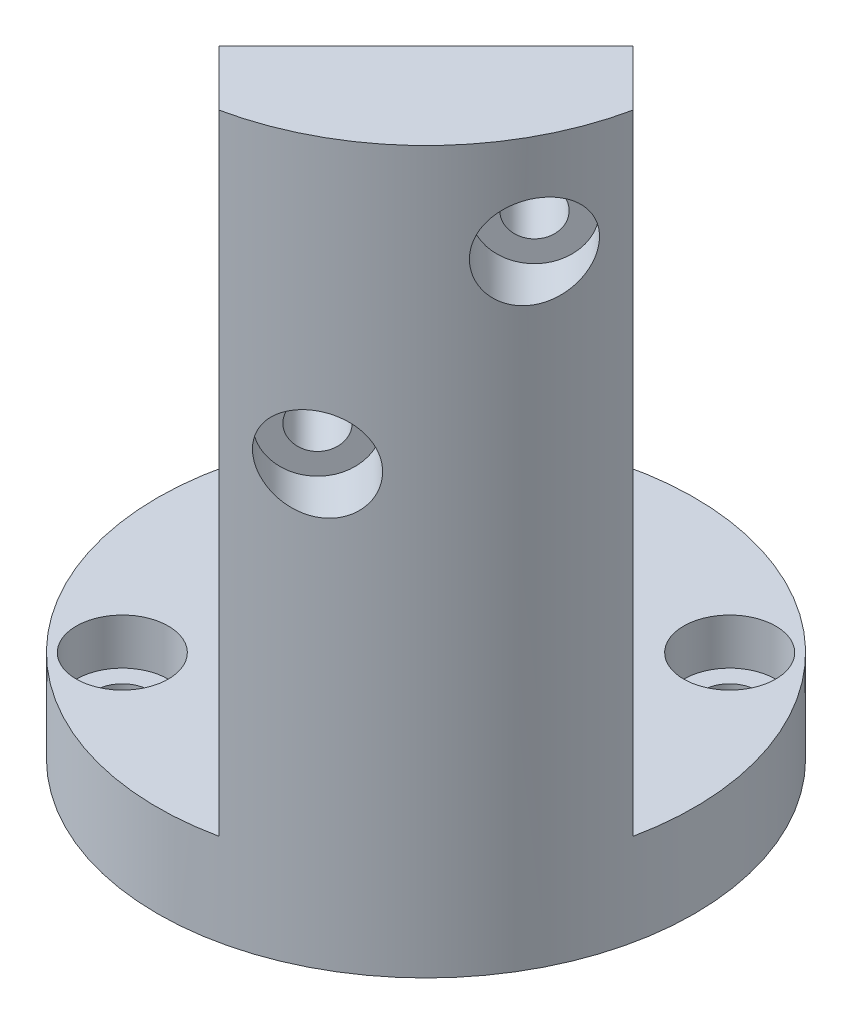
ISO-10303-21;
HEADER;
FILE_DESCRIPTION(('STEP AP214'),'2;1');
FILE_NAME('part.step','',(''),(''),'','','');
FILE_SCHEMA(('AUTOMOTIVE_DESIGN { 1 0 10303 214 1 1 1 1 }'));
ENDSEC;
DATA;
#1=APPLICATION_CONTEXT('core data for automotive mechanical design processes');
#2=APPLICATION_PROTOCOL_DEFINITION('international standard','automotive_design',2000,#1);
#3=PRODUCT_CONTEXT('',#1,'mechanical');
#4=PRODUCT('Part','Part','',(#3));
#5=PRODUCT_RELATED_PRODUCT_CATEGORY('part','',(#4));
#6=PRODUCT_DEFINITION_FORMATION('','',#4);
#7=PRODUCT_DEFINITION_CONTEXT('part definition',#1,'design');
#8=PRODUCT_DEFINITION('design','',#6,#7);
#9=PRODUCT_DEFINITION_SHAPE('','',#8);
#10=(LENGTH_UNIT() NAMED_UNIT(*) SI_UNIT(.MILLI.,.METRE.));
#11=(NAMED_UNIT(*) PLANE_ANGLE_UNIT() SI_UNIT($,.RADIAN.));
#12=(NAMED_UNIT(*) SI_UNIT($,.STERADIAN.) SOLID_ANGLE_UNIT());
#13=UNCERTAINTY_MEASURE_WITH_UNIT(LENGTH_MEASURE(1.E-05),#10,'distance_accuracy_value','');
#14=(GEOMETRIC_REPRESENTATION_CONTEXT(3) GLOBAL_UNCERTAINTY_ASSIGNED_CONTEXT((#13)) GLOBAL_UNIT_ASSIGNED_CONTEXT((#10,
#11,#12)) REPRESENTATION_CONTEXT('',''));
#15=CARTESIAN_POINT('',(0.,0.,0.));
#16=DIRECTION('',(0.,0.,1.));
#17=DIRECTION('',(1.,0.,0.));
#18=AXIS2_PLACEMENT_3D('',#15,#16,#17);
#19=CARTESIAN_POINT('',(-4.75,4.,0.));
#20=DIRECTION('',(0.,-1.,0.));
#21=DIRECTION('',(0.,0.,-1.));
#22=AXIS2_PLACEMENT_3D('',#19,#20,#21);
#23=PLANE('',#22);
#24=CARTESIAN_POINT('',(0.,4.,0.));
#25=DIRECTION('',(0.,1.,0.));
#26=DIRECTION('',(-1.,0.,0.));
#27=AXIS2_PLACEMENT_3D('',#24,#25,#26);
#28=CIRCLE('',#27,3.);
#29=CARTESIAN_POINT('',(-3.,4.,0.));
#30=VERTEX_POINT('',#29);
#31=EDGE_CURVE('E21',#30,#30,#28,.T.);
#32=ORIENTED_EDGE('',*,*,#31,.T.);
#33=EDGE_LOOP('',(#32));
#34=FACE_BOUND('',#33,.T.);
#35=CARTESIAN_POINT('',(0.,4.,0.));
#36=DIRECTION('',(0.,1.,0.));
#37=DIRECTION('',(-1.,0.,0.));
#38=AXIS2_PLACEMENT_3D('',#35,#36,#37);
#39=CIRCLE('',#38,8.5);
#40=CARTESIAN_POINT('',(-8.5,4.,0.));
#41=VERTEX_POINT('',#40);
#42=EDGE_CURVE('E254',#41,#41,#39,.F.);
#43=ORIENTED_EDGE('',*,*,#42,.T.);
#44=EDGE_LOOP('',(#43));
#45=FACE_BOUND('',#44,.T.);
#46=ADVANCED_FACE('F17',(#34,#45),#23,.T.);
#47=CARTESIAN_POINT('',(6.01040764008564,28.5,13.0814754519511));
#48=DIRECTION('',(-0.707106781186548,0.,-0.707106781186548));
#49=DIRECTION('',(-0.707106781186548,0.,0.707106781186548));
#50=AXIS2_PLACEMENT_3D('',#47,#48,#49);
#51=CYLINDRICAL_SURFACE('',#50,1.6);
#52=CARTESIAN_POINT('',(6.01040764008564,28.5,13.0814754519511));
#53=DIRECTION('',(-0.707106781186548,0.,-0.707106781186548));
#54=DIRECTION('',(-0.707106781186548,0.,0.707106781186548));
#55=AXIS2_PLACEMENT_3D('',#52,#53,#54);
#56=CIRCLE('',#55,1.6);
#57=CARTESIAN_POINT('',(4.87903679018717,28.5,14.2128463018496));
#58=VERTEX_POINT('',#57);
#59=EDGE_CURVE('E113',#58,#58,#56,.F.);
#60=ORIENTED_EDGE('',*,*,#59,.T.);
#61=EDGE_LOOP('',(#60));
#62=FACE_BOUND('',#61,.T.);
#63=CARTESIAN_POINT('',(3.21733585439878,28.5,10.2884036662643));
#64=DIRECTION('',(-0.707106781186548,0.,-0.707106781186548));
#65=DIRECTION('',(-0.707106781186548,0.,0.707106781186548));
#66=AXIS2_PLACEMENT_3D('',#63,#64,#65);
#67=CIRCLE('',#66,1.6);
#68=CARTESIAN_POINT('',(2.0859650045003,28.5,11.4197745161627));
#69=VERTEX_POINT('',#68);
#70=EDGE_CURVE('E241',#69,#69,#67,.F.);
#71=ORIENTED_EDGE('',*,*,#70,.F.);
#72=EDGE_LOOP('',(#71));
#73=FACE_BOUND('',#72,.T.);
#74=ADVANCED_FACE('F260',(#62,#73),#51,.F.);
#75=CARTESIAN_POINT('',(13.0814754519511,40.5,6.01040764008565));
#76=DIRECTION('',(-0.707106781186548,0.,-0.707106781186548));
#77=DIRECTION('',(-0.707106781186548,0.,0.707106781186548));
#78=AXIS2_PLACEMENT_3D('',#75,#76,#77);
#79=CYLINDRICAL_SURFACE('',#78,1.6);
#80=CARTESIAN_POINT('',(13.0814754519511,40.5,6.01040764008565));
#81=DIRECTION('',(-0.707106781186548,0.,-0.707106781186548));
#82=DIRECTION('',(-0.707106781186548,0.,0.707106781186548));
#83=AXIS2_PLACEMENT_3D('',#80,#81,#82);
#84=CIRCLE('',#83,1.6);
#85=CARTESIAN_POINT('',(11.9501046020526,40.5,7.14177848998413));
#86=VERTEX_POINT('',#85);
#87=EDGE_CURVE('E234',#86,#86,#84,.F.);
#88=ORIENTED_EDGE('',*,*,#87,.T.);
#89=EDGE_LOOP('',(#88));
#90=FACE_BOUND('',#89,.T.);
#91=CARTESIAN_POINT('',(10.2884036662643,40.5,3.21733585439879));
#92=DIRECTION('',(-0.707106781186548,0.,-0.707106781186548));
#93=DIRECTION('',(-0.707106781186548,0.,0.707106781186548));
#94=AXIS2_PLACEMENT_3D('',#91,#92,#93);
#95=CIRCLE('',#94,1.6);
#96=CARTESIAN_POINT('',(9.15703281636578,40.5,4.34870670429727));
#97=VERTEX_POINT('',#96);
#98=EDGE_CURVE('E114',#97,#97,#95,.F.);
#99=ORIENTED_EDGE('',*,*,#98,.F.);
#100=EDGE_LOOP('',(#99));
#101=FACE_BOUND('',#100,.T.);
#102=ADVANCED_FACE('F264',(#90,#101),#79,.F.);
#103=CARTESIAN_POINT('',(9.89949493661166,3.,-9.89949493661167));
#104=DIRECTION('',(0.,1.,0.));
#105=DIRECTION('',(0.,0.,1.));
#106=AXIS2_PLACEMENT_3D('',#103,#104,#105);
#107=PLANE('',#106);
#108=CARTESIAN_POINT('',(9.89949493661167,3.,-9.89949493661167));
#109=DIRECTION('',(0.,1.,0.));
#110=DIRECTION('',(-1.,0.,0.));
#111=AXIS2_PLACEMENT_3D('',#108,#109,#110);
#112=CIRCLE('',#111,1.75);
#113=CARTESIAN_POINT('',(8.14949493661167,3.,-9.89949493661167));
#114=VERTEX_POINT('',#113);
#115=EDGE_CURVE('E231',#114,#114,#112,.F.);
#116=ORIENTED_EDGE('',*,*,#115,.T.);
#117=EDGE_LOOP('',(#116));
#118=FACE_BOUND('',#117,.T.);
#119=CARTESIAN_POINT('',(9.89949493661166,3.,-9.89949493661167));
#120=DIRECTION('',(0.,1.,0.));
#121=DIRECTION('',(-1.,0.,0.));
#122=AXIS2_PLACEMENT_3D('',#119,#120,#121);
#123=CIRCLE('',#122,3.);
#124=CARTESIAN_POINT('',(6.89949493661166,3.,-9.89949493661167));
#125=VERTEX_POINT('',#124);
#126=EDGE_CURVE('E249',#125,#125,#123,.T.);
#127=ORIENTED_EDGE('',*,*,#126,.T.);
#128=EDGE_LOOP('',(#127));
#129=FACE_BOUND('',#128,.T.);
#130=ADVANCED_FACE('F269',(#118,#129),#107,.T.);
#131=CARTESIAN_POINT('',(-9.89949493661167,3.,9.89949493661167));
#132=DIRECTION('',(0.,1.,0.));
#133=DIRECTION('',(0.,0.,1.));
#134=AXIS2_PLACEMENT_3D('',#131,#132,#133);
#135=PLANE('',#134);
#136=CARTESIAN_POINT('',(-9.89949493661166,3.,9.89949493661167));
#137=DIRECTION('',(0.,1.,0.));
#138=DIRECTION('',(-1.,0.,0.));
#139=AXIS2_PLACEMENT_3D('',#136,#137,#138);
#140=CIRCLE('',#139,1.75);
#141=CARTESIAN_POINT('',(-11.6494949366117,3.,9.89949493661167));
#142=VERTEX_POINT('',#141);
#143=EDGE_CURVE('E228',#142,#142,#140,.F.);
#144=ORIENTED_EDGE('',*,*,#143,.T.);
#145=EDGE_LOOP('',(#144));
#146=FACE_BOUND('',#145,.T.);
#147=CARTESIAN_POINT('',(-9.89949493661167,3.,9.89949493661167));
#148=DIRECTION('',(0.,1.,0.));
#149=DIRECTION('',(-1.,0.,0.));
#150=AXIS2_PLACEMENT_3D('',#147,#148,#149);
#151=CIRCLE('',#150,3.);
#152=CARTESIAN_POINT('',(-12.8994949366117,3.,9.89949493661167));
#153=VERTEX_POINT('',#152);
#154=EDGE_CURVE('E247',#153,#153,#151,.T.);
#155=ORIENTED_EDGE('',*,*,#154,.T.);
#156=EDGE_LOOP('',(#155));
#157=FACE_BOUND('',#156,.T.);
#158=ADVANCED_FACE('F275',(#146,#157),#135,.T.);
#159=CARTESIAN_POINT('',(-9.89949493661167,3.,-9.89949493661166));
#160=DIRECTION('',(0.,1.,0.));
#161=DIRECTION('',(0.,0.,1.));
#162=AXIS2_PLACEMENT_3D('',#159,#160,#161);
#163=PLANE('',#162);
#164=CARTESIAN_POINT('',(-9.89949493661167,3.,-9.89949493661166));
#165=DIRECTION('',(0.,1.,0.));
#166=DIRECTION('',(-1.,0.,0.));
#167=AXIS2_PLACEMENT_3D('',#164,#165,#166);
#168=CIRCLE('',#167,1.75);
#169=CARTESIAN_POINT('',(-11.6494949366117,3.,-9.89949493661166));
#170=VERTEX_POINT('',#169);
#171=EDGE_CURVE('E108',#170,#170,#168,.F.);
#172=ORIENTED_EDGE('',*,*,#171,.T.);
#173=EDGE_LOOP('',(#172));
#174=FACE_BOUND('',#173,.T.);
#175=CARTESIAN_POINT('',(-9.89949493661167,3.,-9.89949493661166));
#176=DIRECTION('',(0.,1.,0.));
#177=DIRECTION('',(-1.,0.,0.));
#178=AXIS2_PLACEMENT_3D('',#175,#176,#177);
#179=CIRCLE('',#178,3.);
#180=CARTESIAN_POINT('',(-12.8994949366117,3.,-9.89949493661166));
#181=VERTEX_POINT('',#180);
#182=EDGE_CURVE('E244',#181,#181,#179,.T.);
#183=ORIENTED_EDGE('',*,*,#182,.T.);
#184=EDGE_LOOP('',(#183));
#185=FACE_BOUND('',#184,.T.);
#186=ADVANCED_FACE('F129',(#174,#185),#163,.T.);
#187=CARTESIAN_POINT('',(0.,3.,0.));
#188=DIRECTION('',(0.,1.,0.));
#189=DIRECTION('',(0.,0.,1.));
#190=AXIS2_PLACEMENT_3D('',#187,#188,#189);
#191=TOROIDAL_SURFACE('',#190,8.5,1.);
#192=CARTESIAN_POINT('',(0.,3.,0.));
#193=DIRECTION('',(0.,1.,0.));
#194=DIRECTION('',(-1.,0.,0.));
#195=AXIS2_PLACEMENT_3D('',#192,#193,#194);
#196=CIRCLE('',#195,9.5);
#197=CARTESIAN_POINT('',(-9.5,3.,0.));
#198=VERTEX_POINT('',#197);
#199=EDGE_CURVE('E105',#198,#198,#196,.F.);
#200=ORIENTED_EDGE('',*,*,#199,.T.);
#201=EDGE_LOOP('',(#200));
#202=FACE_BOUND('',#201,.T.);
#203=ORIENTED_EDGE('',*,*,#42,.F.);
#204=EDGE_LOOP('',(#203));
#205=FACE_BOUND('',#204,.T.);
#206=ADVANCED_FACE('F123',(#202,#205),#191,.F.);
#207=CARTESIAN_POINT('',(0.,-62.2568677863261,0.));
#208=DIRECTION('',(0.,1.,0.));
#209=DIRECTION('',(-1.,0.,0.));
#210=AXIS2_PLACEMENT_3D('',#207,#208,#209);
#211=CYLINDRICAL_SURFACE('',#210,3.);
#212=CARTESIAN_POINT('',(0.,6.00000000000001,0.));
#213=DIRECTION('',(0.,1.,0.));
#214=DIRECTION('',(-1.,0.,0.));
#215=AXIS2_PLACEMENT_3D('',#212,#213,#214);
#216=CIRCLE('',#215,3.);
#217=CARTESIAN_POINT('',(-3.,6.,0.));
#218=VERTEX_POINT('',#217);
#219=EDGE_CURVE('E112',#218,#218,#216,.F.);
#220=ORIENTED_EDGE('',*,*,#219,.F.);
#221=EDGE_LOOP('',(#220));
#222=FACE_BOUND('',#221,.T.);
#223=ORIENTED_EDGE('',*,*,#31,.F.);
#224=EDGE_LOOP('',(#223));
#225=FACE_BOUND('',#224,.T.);
#226=ADVANCED_FACE('F128',(#222,#225),#211,.F.);
#227=CARTESIAN_POINT('',(9.89949493661166,4.5,-9.89949493661167));
#228=DIRECTION('',(0.,1.,0.));
#229=DIRECTION('',(-1.,0.,0.));
#230=AXIS2_PLACEMENT_3D('',#227,#228,#229);
#231=CYLINDRICAL_SURFACE('',#230,3.);
#232=ORIENTED_EDGE('',*,*,#126,.F.);
#233=EDGE_LOOP('',(#232));
#234=FACE_BOUND('',#233,.T.);
#235=CARTESIAN_POINT('',(9.89949493661166,6.,-9.89949493661167));
#236=DIRECTION('',(0.,1.,0.));
#237=DIRECTION('',(-1.,0.,0.));
#238=AXIS2_PLACEMENT_3D('',#235,#236,#237);
#239=CIRCLE('',#238,3.);
#240=CARTESIAN_POINT('',(6.89949493661166,6.,-9.89949493661167));
#241=VERTEX_POINT('',#240);
#242=EDGE_CURVE('E221',#241,#241,#239,.F.);
#243=ORIENTED_EDGE('',*,*,#242,.F.);
#244=EDGE_LOOP('',(#243));
#245=FACE_BOUND('',#244,.T.);
#246=ADVANCED_FACE('F291',(#234,#245),#231,.F.);
#247=CARTESIAN_POINT('',(-9.89949493661167,4.5,9.89949493661167));
#248=DIRECTION('',(0.,1.,0.));
#249=DIRECTION('',(-1.,0.,0.));
#250=AXIS2_PLACEMENT_3D('',#247,#248,#249);
#251=CYLINDRICAL_SURFACE('',#250,3.);
#252=ORIENTED_EDGE('',*,*,#154,.F.);
#253=EDGE_LOOP('',(#252));
#254=FACE_BOUND('',#253,.T.);
#255=CARTESIAN_POINT('',(-9.89949493661167,6.,9.89949493661167));
#256=DIRECTION('',(0.,1.,0.));
#257=DIRECTION('',(-1.,0.,0.));
#258=AXIS2_PLACEMENT_3D('',#255,#256,#257);
#259=CIRCLE('',#258,3.);
#260=CARTESIAN_POINT('',(-12.8994949366117,6.,9.89949493661167));
#261=VERTEX_POINT('',#260);
#262=EDGE_CURVE('E218',#261,#261,#259,.F.);
#263=ORIENTED_EDGE('',*,*,#262,.F.);
#264=EDGE_LOOP('',(#263));
#265=FACE_BOUND('',#264,.T.);
#266=ADVANCED_FACE('F287',(#254,#265),#251,.F.);
#267=CARTESIAN_POINT('',(-9.89949493661167,4.5,-9.89949493661166));
#268=DIRECTION('',(0.,1.,0.));
#269=DIRECTION('',(-1.,0.,0.));
#270=AXIS2_PLACEMENT_3D('',#267,#268,#269);
#271=CYLINDRICAL_SURFACE('',#270,3.);
#272=ORIENTED_EDGE('',*,*,#182,.F.);
#273=EDGE_LOOP('',(#272));
#274=FACE_BOUND('',#273,.T.);
#275=CARTESIAN_POINT('',(-9.89949493661167,6.,-9.89949493661166));
#276=DIRECTION('',(0.,1.,0.));
#277=DIRECTION('',(-1.,0.,0.));
#278=AXIS2_PLACEMENT_3D('',#275,#276,#277);
#279=CIRCLE('',#278,3.);
#280=CARTESIAN_POINT('',(-12.8994949366117,6.,-9.89949493661166));
#281=VERTEX_POINT('',#280);
#282=EDGE_CURVE('E104',#281,#281,#279,.F.);
#283=ORIENTED_EDGE('',*,*,#282,.F.);
#284=EDGE_LOOP('',(#283));
#285=FACE_BOUND('',#284,.T.);
#286=ADVANCED_FACE('F290',(#274,#285),#271,.F.);
#287=CARTESIAN_POINT('',(0.,6.,13.5057395206631));
#288=DIRECTION('',(-0.707106781186548,0.,-0.707106781186548));
#289=DIRECTION('',(-0.707106781186548,0.,0.707106781186548));
#290=AXIS2_PLACEMENT_3D('',#287,#288,#289);
#291=PLANE('',#290);
#292=ORIENTED_EDGE('',*,*,#98,.T.);
#293=EDGE_LOOP('',(#292));
#294=FACE_BOUND('',#293,.T.);
#295=ORIENTED_EDGE('',*,*,#70,.T.);
#296=EDGE_LOOP('',(#295));
#297=FACE_BOUND('',#296,.T.);
#298=DIRECTION('',(-0.707106781186547,0.,0.707106781186547));
#299=VECTOR('',#298,1.);
#300=CARTESIAN_POINT('',(13.505739520663,47.,0.));
#301=LINE('',#300,#299);
#302=CARTESIAN_POINT('',(13.505739520663,47.,0.));
#303=VERTEX_POINT('',#302);
#304=CARTESIAN_POINT('',(0.,47.,13.5057395206631));
#305=VERTEX_POINT('',#304);
#306=EDGE_CURVE('E73',#303,#305,#301,.T.);
#307=ORIENTED_EDGE('',*,*,#306,.F.);
#308=DIRECTION('',(0.,1.,0.));
#309=VECTOR('',#308,1.);
#310=CARTESIAN_POINT('',(13.5057395206631,6.00000000000001,0.));
#311=LINE('',#310,#309);
#312=CARTESIAN_POINT('',(13.5057395206631,8.00000000000001,0.));
#313=VERTEX_POINT('',#312);
#314=EDGE_CURVE('E69',#313,#303,#311,.T.);
#315=ORIENTED_EDGE('',*,*,#314,.F.);
#316=DIRECTION('',(0.707106781186548,0.,-0.707106781186548));
#317=VECTOR('',#316,1.);
#318=CARTESIAN_POINT('',(1.18893488016576,8.,12.3168046404973));
#319=LINE('',#318,#317);
#320=CARTESIAN_POINT('',(0.,8.,13.5057395206631));
#321=VERTEX_POINT('',#320);
#322=EDGE_CURVE('E64',#313,#321,#319,.F.);
#323=ORIENTED_EDGE('',*,*,#322,.T.);
#324=DIRECTION('',(0.,1.,0.));
#325=VECTOR('',#324,1.);
#326=CARTESIAN_POINT('',(0.,6.,13.5057395206631));
#327=LINE('',#326,#325);
#328=EDGE_CURVE('E80',#305,#321,#327,.F.);
#329=ORIENTED_EDGE('',*,*,#328,.F.);
#330=EDGE_LOOP('',(#307,#315,#323,#329));
#331=FACE_BOUND('',#330,.T.);
#332=ADVANCED_FACE('F81',(#294,#297,#331),#291,.T.);
#333=CARTESIAN_POINT('',(-0.225278682207334,8.,10.9025910781242));
#334=DIRECTION('',(0.707106781186548,0.,-0.707106781186548));
#335=DIRECTION('',(-0.707106781186548,0.,-0.707106781186548));
#336=AXIS2_PLACEMENT_3D('',#333,#334,#335);
#337=CYLINDRICAL_SURFACE('',#336,2.);
#338=ORIENTED_EDGE('',*,*,#322,.F.);
#339=CARTESIAN_POINT('',(12.09152595829,8.,-1.4142135623731));
#340=DIRECTION('',(0.707106781186548,0.,-0.707106781186548));
#341=DIRECTION('',(-0.707106781186548,0.,-0.707106781186548));
#342=AXIS2_PLACEMENT_3D('',#339,#340,#341);
#343=CIRCLE('',#342,2.);
#344=CARTESIAN_POINT('',(12.09152595829,6.,-1.4142135623731));
#345=VERTEX_POINT('',#344);
#346=EDGE_CURVE('E98',#345,#313,#343,.F.);
#347=ORIENTED_EDGE('',*,*,#346,.F.);
#348=DIRECTION('',(0.707106781186547,0.,-0.707106781186547));
#349=VECTOR('',#348,1.);
#350=CARTESIAN_POINT('',(-1.4142135623731,6.,12.09152595829));
#351=LINE('',#350,#349);
#352=CARTESIAN_POINT('',(-1.4142135623731,6.,12.09152595829));
#353=VERTEX_POINT('',#352);
#354=EDGE_CURVE('E58',#353,#345,#351,.T.);
#355=ORIENTED_EDGE('',*,*,#354,.F.);
#356=CARTESIAN_POINT('',(-1.4142135623731,8.,12.09152595829));
#357=DIRECTION('',(0.707106781186548,0.,-0.707106781186548));
#358=DIRECTION('',(-0.707106781186548,0.,-0.707106781186548));
#359=AXIS2_PLACEMENT_3D('',#356,#357,#358);
#360=CIRCLE('',#359,2.);
#361=EDGE_CURVE('E84',#321,#353,#360,.T.);
#362=ORIENTED_EDGE('',*,*,#361,.F.);
#363=EDGE_LOOP('',(#338,#347,#355,#362));
#364=FACE_BOUND('',#363,.T.);
#365=ADVANCED_FACE('F306',(#364),#337,.F.);
#366=CARTESIAN_POINT('',(6.01040764008564,28.5,13.0814754519511));
#367=DIRECTION('',(-0.707106781186548,0.,-0.707106781186548));
#368=DIRECTION('',(-0.707106781186548,0.,0.707106781186548));
#369=AXIS2_PLACEMENT_3D('',#366,#367,#368);
#370=PLANE('',#369);
#371=ORIENTED_EDGE('',*,*,#59,.F.);
#372=EDGE_LOOP('',(#371));
#373=FACE_BOUND('',#372,.T.);
#374=CARTESIAN_POINT('',(6.01040764008564,28.5,13.0814754519511));
#375=DIRECTION('',(-0.707106781186548,0.,-0.707106781186548));
#376=DIRECTION('',(-0.707106781186548,0.,0.707106781186548));
#377=AXIS2_PLACEMENT_3D('',#374,#375,#376);
#378=CIRCLE('',#377,3.);
#379=CARTESIAN_POINT('',(3.889087296526,28.5,15.2027957955108));
#380=VERTEX_POINT('',#379);
#381=EDGE_CURVE('E210',#380,#380,#378,.F.);
#382=ORIENTED_EDGE('',*,*,#381,.T.);
#383=EDGE_LOOP('',(#382));
#384=FACE_BOUND('',#383,.T.);
#385=ADVANCED_FACE('F338',(#373,#384),#370,.F.);
#386=CARTESIAN_POINT('',(13.0814754519511,40.5,6.01040764008565));
#387=DIRECTION('',(-0.707106781186548,0.,-0.707106781186548));
#388=DIRECTION('',(-0.707106781186548,0.,0.707106781186548));
#389=AXIS2_PLACEMENT_3D('',#386,#387,#388);
#390=PLANE('',#389);
#391=ORIENTED_EDGE('',*,*,#87,.F.);
#392=EDGE_LOOP('',(#391));
#393=FACE_BOUND('',#392,.T.);
#394=CARTESIAN_POINT('',(13.0814754519511,40.5,6.01040764008565));
#395=DIRECTION('',(-0.707106781186548,0.,-0.707106781186548));
#396=DIRECTION('',(-0.707106781186548,0.,0.707106781186548));
#397=AXIS2_PLACEMENT_3D('',#394,#395,#396);
#398=CIRCLE('',#397,3.);
#399=CARTESIAN_POINT('',(10.9601551083915,40.5,8.13172798364529));
#400=VERTEX_POINT('',#399);
#401=EDGE_CURVE('E207',#400,#400,#398,.F.);
#402=ORIENTED_EDGE('',*,*,#401,.T.);
#403=EDGE_LOOP('',(#402));
#404=FACE_BOUND('',#403,.T.);
#405=ADVANCED_FACE('F334',(#393,#404),#390,.F.);
#406=CARTESIAN_POINT('',(9.89949493661168,-43.8598034492716,-9.89949493661167));
#407=DIRECTION('',(0.,1.,0.));
#408=DIRECTION('',(-1.,0.,0.));
#409=AXIS2_PLACEMENT_3D('',#406,#407,#408);
#410=CYLINDRICAL_SURFACE('',#409,1.75);
#411=ORIENTED_EDGE('',*,*,#115,.F.);
#412=EDGE_LOOP('',(#411));
#413=FACE_BOUND('',#412,.T.);
#414=CARTESIAN_POINT('',(9.89949493661167,0.,-9.89949493661167));
#415=DIRECTION('',(0.,1.,0.));
#416=DIRECTION('',(-1.,0.,0.));
#417=AXIS2_PLACEMENT_3D('',#414,#415,#416);
#418=CIRCLE('',#417,1.75);
#419=CARTESIAN_POINT('',(8.14949493661167,0.,-9.89949493661167));
#420=VERTEX_POINT('',#419);
#421=EDGE_CURVE('E187',#420,#420,#418,.T.);
#422=ORIENTED_EDGE('',*,*,#421,.F.);
#423=EDGE_LOOP('',(#422));
#424=FACE_BOUND('',#423,.T.);
#425=ADVANCED_FACE('F330',(#413,#424),#410,.F.);
#426=CARTESIAN_POINT('',(-9.89949493661165,-43.8598034492716,9.89949493661167));
#427=DIRECTION('',(0.,1.,0.));
#428=DIRECTION('',(-1.,0.,0.));
#429=AXIS2_PLACEMENT_3D('',#426,#427,#428);
#430=CYLINDRICAL_SURFACE('',#429,1.75);
#431=ORIENTED_EDGE('',*,*,#143,.F.);
#432=EDGE_LOOP('',(#431));
#433=FACE_BOUND('',#432,.T.);
#434=CARTESIAN_POINT('',(-9.89949493661166,0.,9.89949493661167));
#435=DIRECTION('',(0.,1.,0.));
#436=DIRECTION('',(-1.,0.,0.));
#437=AXIS2_PLACEMENT_3D('',#434,#435,#436);
#438=CIRCLE('',#437,1.75);
#439=CARTESIAN_POINT('',(-11.6494949366117,0.,9.89949493661167));
#440=VERTEX_POINT('',#439);
#441=EDGE_CURVE('E183',#440,#440,#438,.T.);
#442=ORIENTED_EDGE('',*,*,#441,.F.);
#443=EDGE_LOOP('',(#442));
#444=FACE_BOUND('',#443,.T.);
#445=ADVANCED_FACE('F326',(#433,#444),#430,.F.);
#446=CARTESIAN_POINT('',(-9.89949493661166,-43.8598034492716,-9.89949493661166));
#447=DIRECTION('',(0.,1.,0.));
#448=DIRECTION('',(-1.,0.,0.));
#449=AXIS2_PLACEMENT_3D('',#446,#447,#448);
#450=CYLINDRICAL_SURFACE('',#449,1.75);
#451=ORIENTED_EDGE('',*,*,#171,.F.);
#452=EDGE_LOOP('',(#451));
#453=FACE_BOUND('',#452,.T.);
#454=CARTESIAN_POINT('',(-9.89949493661167,0.,-9.89949493661166));
#455=DIRECTION('',(0.,1.,0.));
#456=DIRECTION('',(-1.,0.,0.));
#457=AXIS2_PLACEMENT_3D('',#454,#455,#456);
#458=CIRCLE('',#457,1.75);
#459=CARTESIAN_POINT('',(-11.6494949366117,0.,-9.89949493661166));
#460=VERTEX_POINT('',#459);
#461=EDGE_CURVE('E179',#460,#460,#458,.T.);
#462=ORIENTED_EDGE('',*,*,#461,.F.);
#463=EDGE_LOOP('',(#462));
#464=FACE_BOUND('',#463,.T.);
#465=ADVANCED_FACE('F322',(#453,#464),#450,.F.);
#466=CARTESIAN_POINT('',(0.,2.,0.));
#467=DIRECTION('',(0.,1.,0.));
#468=DIRECTION('',(-1.,0.,0.));
#469=AXIS2_PLACEMENT_3D('',#466,#467,#468);
#470=CYLINDRICAL_SURFACE('',#469,9.5);
#471=ORIENTED_EDGE('',*,*,#199,.F.);
#472=EDGE_LOOP('',(#471));
#473=FACE_BOUND('',#472,.T.);
#474=CARTESIAN_POINT('',(0.,0.,0.));
#475=DIRECTION('',(0.,1.,0.));
#476=DIRECTION('',(-1.,0.,0.));
#477=AXIS2_PLACEMENT_3D('',#474,#475,#476);
#478=CIRCLE('',#477,9.5);
#479=CARTESIAN_POINT('',(-9.5,0.,0.));
#480=VERTEX_POINT('',#479);
#481=EDGE_CURVE('E175',#480,#480,#478,.T.);
#482=ORIENTED_EDGE('',*,*,#481,.F.);
#483=EDGE_LOOP('',(#482));
#484=FACE_BOUND('',#483,.T.);
#485=ADVANCED_FACE('F299',(#473,#484),#470,.F.);
#486=CARTESIAN_POINT('',(-8.75,6.,0.));
#487=DIRECTION('',(0.,1.,0.));
#488=DIRECTION('',(0.,0.,1.));
#489=AXIS2_PLACEMENT_3D('',#486,#487,#488);
#490=PLANE('',#489);
#491=ORIENTED_EDGE('',*,*,#282,.T.);
#492=EDGE_LOOP('',(#491));
#493=FACE_BOUND('',#492,.T.);
#494=ORIENTED_EDGE('',*,*,#262,.T.);
#495=EDGE_LOOP('',(#494));
#496=FACE_BOUND('',#495,.T.);
#497=ORIENTED_EDGE('',*,*,#242,.T.);
#498=EDGE_LOOP('',(#497));
#499=FACE_BOUND('',#498,.T.);
#500=ORIENTED_EDGE('',*,*,#219,.T.);
#501=EDGE_LOOP('',(#500));
#502=FACE_BOUND('',#501,.T.);
#503=DIRECTION('',(0.707106781186548,0.,0.707106781186547));
#504=VECTOR('',#503,1.);
#505=CARTESIAN_POINT('',(3.61649617978265,6.,17.1222357004457));
#506=LINE('',#505,#504);
#507=CARTESIAN_POINT('',(3.61649617978265,6.,17.1222357004457));
#508=VERTEX_POINT('',#507);
#509=EDGE_CURVE('E213',#353,#508,#506,.T.);
#510=ORIENTED_EDGE('',*,*,#509,.F.);
#511=ORIENTED_EDGE('',*,*,#354,.T.);
#512=DIRECTION('',(-0.707106781186548,0.,-0.707106781186548));
#513=VECTOR('',#512,1.);
#514=CARTESIAN_POINT('',(13.5057395206631,6.00000000000001,0.));
#515=LINE('',#514,#513);
#516=CARTESIAN_POINT('',(17.1222357004457,6.,3.61649617978265));
#517=VERTEX_POINT('',#516);
#518=EDGE_CURVE('E101',#517,#345,#515,.T.);
#519=ORIENTED_EDGE('',*,*,#518,.F.);
#520=CARTESIAN_POINT('',(0.,6.,0.));
#521=DIRECTION('',(0.,1.,0.));
#522=DIRECTION('',(-1.,0.,0.));
#523=AXIS2_PLACEMENT_3D('',#520,#521,#522);
#524=CIRCLE('',#523,17.5);
#525=EDGE_CURVE('E200',#508,#517,#524,.F.);
#526=ORIENTED_EDGE('',*,*,#525,.F.);
#527=EDGE_LOOP('',(#510,#511,#519,#526));
#528=FACE_BOUND('',#527,.T.);
#529=ADVANCED_FACE('F295',(#493,#496,#499,#502,#528),#490,.T.);
#530=CARTESIAN_POINT('',(13.5057395206631,6.00000000000001,0.));
#531=DIRECTION('',(0.707106781186548,0.,-0.707106781186548));
#532=DIRECTION('',(-0.707106781186548,0.,-0.707106781186548));
#533=AXIS2_PLACEMENT_3D('',#530,#531,#532);
#534=PLANE('',#533);
#535=ORIENTED_EDGE('',*,*,#346,.T.);
#536=ORIENTED_EDGE('',*,*,#314,.T.);
#537=DIRECTION('',(-0.707106781186548,0.,-0.707106781186547));
#538=VECTOR('',#537,1.);
#539=CARTESIAN_POINT('',(17.1222357004457,47.,3.61649617978265));
#540=LINE('',#539,#538);
#541=CARTESIAN_POINT('',(17.1222357004457,47.,3.61649617978265));
#542=VERTEX_POINT('',#541);
#543=EDGE_CURVE('E76',#542,#303,#540,.T.);
#544=ORIENTED_EDGE('',*,*,#543,.F.);
#545=DIRECTION('',(0.,1.,0.));
#546=VECTOR('',#545,1.);
#547=CARTESIAN_POINT('',(17.1222357004457,3.00000000000001,3.61649617978265));
#548=LINE('',#547,#546);
#549=EDGE_CURVE('E199',#517,#542,#548,.T.);
#550=ORIENTED_EDGE('',*,*,#549,.F.);
#551=ORIENTED_EDGE('',*,*,#518,.T.);
#552=EDGE_LOOP('',(#535,#536,#544,#550,#551));
#553=FACE_BOUND('',#552,.T.);
#554=ADVANCED_FACE('F298',(#553),#534,.T.);
#555=CARTESIAN_POINT('',(9.08943628109238,47.,9.08943628109239));
#556=DIRECTION('',(0.,1.,0.));
#557=DIRECTION('',(0.,0.,1.));
#558=AXIS2_PLACEMENT_3D('',#555,#556,#557);
#559=PLANE('',#558);
#560=ORIENTED_EDGE('',*,*,#543,.T.);
#561=ORIENTED_EDGE('',*,*,#306,.T.);
#562=DIRECTION('',(0.707106781186548,0.,0.707106781186547));
#563=VECTOR('',#562,1.);
#564=CARTESIAN_POINT('',(3.61649617978264,47.,17.1222357004457));
#565=LINE('',#564,#563);
#566=CARTESIAN_POINT('',(3.61649617978263,47.,17.1222357004457));
#567=VERTEX_POINT('',#566);
#568=EDGE_CURVE('E36',#567,#305,#565,.F.);
#569=ORIENTED_EDGE('',*,*,#568,.F.);
#570=CARTESIAN_POINT('',(0.,47.,0.));
#571=DIRECTION('',(0.,1.,0.));
#572=DIRECTION('',(-1.,0.,0.));
#573=AXIS2_PLACEMENT_3D('',#570,#571,#572);
#574=CIRCLE('',#573,17.5);
#575=EDGE_CURVE('E196',#542,#567,#574,.F.);
#576=ORIENTED_EDGE('',*,*,#575,.F.);
#577=EDGE_LOOP('',(#560,#561,#569,#576));
#578=FACE_BOUND('',#577,.T.);
#579=ADVANCED_FACE('F75',(#578),#559,.T.);
#580=CARTESIAN_POINT('',(3.61649617978265,6.,17.1222357004457));
#581=DIRECTION('',(-0.707106781186547,0.,0.707106781186548));
#582=DIRECTION('',(0.707106781186548,0.,0.707106781186547));
#583=AXIS2_PLACEMENT_3D('',#580,#581,#582);
#584=PLANE('',#583);
#585=ORIENTED_EDGE('',*,*,#509,.T.);
#586=DIRECTION('',(0.,1.,0.));
#587=VECTOR('',#586,1.);
#588=CARTESIAN_POINT('',(3.61649617978265,3.,17.1222357004457));
#589=LINE('',#588,#587);
#590=EDGE_CURVE('E89',#567,#508,#589,.F.);
#591=ORIENTED_EDGE('',*,*,#590,.F.);
#592=ORIENTED_EDGE('',*,*,#568,.T.);
#593=ORIENTED_EDGE('',*,*,#328,.T.);
#594=ORIENTED_EDGE('',*,*,#361,.T.);
#595=EDGE_LOOP('',(#585,#591,#592,#593,#594));
#596=FACE_BOUND('',#595,.T.);
#597=ADVANCED_FACE('F87',(#596),#584,.T.);
#598=CARTESIAN_POINT('',(7.42462120245874,28.5,14.4956890143242));
#599=DIRECTION('',(-0.707106781186548,0.,-0.707106781186548));
#600=DIRECTION('',(-0.707106781186548,0.,0.707106781186548));
#601=AXIS2_PLACEMENT_3D('',#598,#599,#600);
#602=CYLINDRICAL_SURFACE('',#601,3.);
#603=ORIENTED_EDGE('',*,*,#381,.F.);
#604=EDGE_LOOP('',(#603));
#605=FACE_BOUND('',#604,.T.);
#606=CARTESIAN_POINT('',(5.34882610203518,28.5,16.66253460102));
#607=CARTESIAN_POINT('',(5.34883874513088,28.6563553790986,16.6625326275908));
#608=CARTESIAN_POINT('',(5.36199461805455,28.8128118665438,16.6583251068547));
#609=CARTESIAN_POINT('',(5.41385852978899,29.1210393502163,16.6415395903935));
#610=CARTESIAN_POINT('',(5.45259302611031,29.2728053244316,16.6289529275077));
#611=CARTESIAN_POINT('',(5.55324998206163,29.5668720854549,16.5956075643921));
#612=CARTESIAN_POINT('',(5.61509616769958,29.7092022133182,16.574875733696));
#613=CARTESIAN_POINT('',(5.75898664170919,29.9816730804501,16.5254300087126));
#614=CARTESIAN_POINT('',(5.84103273516171,30.1118127289317,16.4967154010481));
#615=CARTESIAN_POINT('',(6.02706016327172,30.3642905843843,16.4296933964201));
#616=CARTESIAN_POINT('',(6.13200251057565,30.4858012924245,16.3909438797424));
#617=CARTESIAN_POINT('',(6.35697085286849,30.7104845481835,16.3050122054991));
#618=CARTESIAN_POINT('',(6.47700270773374,30.8136499338742,16.2578267688973));
#619=CARTESIAN_POINT('',(6.74085535890049,31.0090330410452,16.1503264470149));
#620=CARTESIAN_POINT('',(6.88585445976888,31.0992076239343,16.0891806276521));
#621=CARTESIAN_POINT('',(7.18527995108581,31.2535185908497,15.9577096488717));
#622=CARTESIAN_POINT('',(7.33970941840846,31.3176464237428,15.8873814848929));
#623=CARTESIAN_POINT('',(7.66044158061378,31.4202812187582,15.7353243201864));
#624=CARTESIAN_POINT('',(7.8269689102451,31.4575598636189,15.653233742232));
#625=CARTESIAN_POINT('',(8.16049403288709,31.5001559100619,15.4819718721318));
#626=CARTESIAN_POINT('',(8.32749176017946,31.5054775743028,15.3928015259457));
#627=CARTESIAN_POINT('',(8.65276935503417,31.4833629197478,15.2122757248399));
#628=CARTESIAN_POINT('',(8.8111626213125,31.4567292081728,15.1210279821391));
#629=CARTESIAN_POINT('',(9.11869302539922,31.3719203810281,14.9375860328572));
#630=CARTESIAN_POINT('',(9.26783304987635,31.3137551578215,14.8453921320088));
#631=CARTESIAN_POINT('',(9.54515140001823,31.17069230589,14.6685313919952));
#632=CARTESIAN_POINT('',(9.67400639266233,31.087284466958,14.5837190928418));
#633=CARTESIAN_POINT('',(9.91579708649714,30.8950758194108,14.4204116417773));
#634=CARTESIAN_POINT('',(10.0287357804342,30.7862797947888,14.3419153034685));
#635=CARTESIAN_POINT('',(10.2324167146773,30.5503368526669,14.1972807896123));
#636=CARTESIAN_POINT('',(10.323766059854,30.4239098661103,14.130821440355));
#637=CARTESIAN_POINT('',(10.4869001903639,30.1537587356773,14.0101836990376));
#638=CARTESIAN_POINT('',(10.5586861298303,30.010035612899,13.9560045825434));
#639=CARTESIAN_POINT('',(10.6806918005009,29.7108315328011,13.8628527826827));
#640=CARTESIAN_POINT('',(10.7311052509107,29.5554718992212,13.8237438130461));
#641=CARTESIAN_POINT('',(10.8104237103581,29.2362491716189,13.7618054845162));
#642=CARTESIAN_POINT('',(10.8393287276279,29.0723860808513,13.7389761193918));
#643=CARTESIAN_POINT('',(10.8751527383459,28.740723614652,13.7106376242124));
#644=CARTESIAN_POINT('',(10.8820609914732,28.5729223566062,13.7051369552229));
#645=CARTESIAN_POINT('',(10.8737493041733,28.2382149919636,13.7117322755621));
#646=CARTESIAN_POINT('',(10.8585292306908,28.0713088907555,13.7238283706981));
#647=CARTESIAN_POINT('',(10.8061893904817,27.7429969553137,13.7650778833929));
#648=CARTESIAN_POINT('',(10.7690526452441,27.5815954880865,13.7942445250983));
#649=CARTESIAN_POINT('',(10.6735044955252,27.2690238690925,13.868306754637));
#650=CARTESIAN_POINT('',(10.6150934189974,27.1178535596502,13.9132021000048));
#651=CARTESIAN_POINT('',(10.4781452921054,26.8301806941691,14.0166256964999));
#652=CARTESIAN_POINT('',(10.3996274510002,26.6936643139976,14.0751409308566));
#653=CARTESIAN_POINT('',(10.2240360266074,26.4389804856008,14.2031989214329));
#654=CARTESIAN_POINT('',(10.126963140334,26.3208123484318,14.2727412634061));
#655=CARTESIAN_POINT('',(9.91642980085958,26.1060496976318,14.419808281963));
#656=CARTESIAN_POINT('',(9.80297127257192,26.0094526533128,14.4973320206205));
#657=CARTESIAN_POINT('',(9.56237456330759,25.8402400739067,14.6571424331424));
#658=CARTESIAN_POINT('',(9.43523620566709,25.7676248485745,14.7394291685107));
#659=CARTESIAN_POINT('',(9.16904628491385,25.6472642156617,14.9064925624845));
#660=CARTESIAN_POINT('',(9.0298822673543,25.5997919054268,14.9912864055379));
#661=CARTESIAN_POINT('',(8.74442300537644,25.5315324636129,15.1595688406406));
#662=CARTESIAN_POINT('',(8.59812668277399,25.5107493796846,15.2430572328111));
#663=CARTESIAN_POINT('',(8.29723717253579,25.495442643413,15.4089689734946));
#664=CARTESIAN_POINT('',(8.14252957223186,25.5018095442049,15.4912659330942));
#665=CARTESIAN_POINT('',(7.83355875975183,25.5419399644577,15.6497777492704));
#666=CARTESIAN_POINT('',(7.67929567206531,25.5757105277522,15.7259910365678));
#667=CARTESIAN_POINT('',(7.36771207140035,25.671646835307,15.8744460780187));
#668=CARTESIAN_POINT('',(7.2106150141935,25.7351288387759,15.9463075072322));
#669=CARTESIAN_POINT('',(6.90583715731556,25.8890262653024,16.0806464240002));
#670=CARTESIAN_POINT('',(6.75815923467536,25.9794498701689,16.1431210522246));
#671=CARTESIAN_POINT('',(6.47285805067571,26.1882167729522,16.2596597053835));
#672=CARTESIAN_POINT('',(6.33564366196608,26.3072852438008,16.3134317519549));
#673=CARTESIAN_POINT('',(6.08151133600034,26.5693055212824,16.4098667034805));
#674=CARTESIAN_POINT('',(5.96459512830116,26.712259361093,16.4525286619268));
#675=CARTESIAN_POINT('',(5.76094349299746,27.0127363702411,16.5249145116303));
#676=CARTESIAN_POINT('',(5.67318986987639,27.1694504971499,16.5550867657027));
#677=CARTESIAN_POINT('',(5.56351102455659,27.4151865285156,16.5921313211451));
#678=CARTESIAN_POINT('',(5.53061840005025,27.4988419664828,16.6031079044303));
#679=CARTESIAN_POINT('',(5.47262233777136,27.6691023397706,16.6223144896943));
#680=CARTESIAN_POINT('',(5.44751576014646,27.7557060704663,16.6305455989324));
#681=CARTESIAN_POINT('',(5.40089589599653,27.9506306195075,16.6457521811359));
#682=CARTESIAN_POINT('',(5.38142057165147,28.0595011595946,16.6520422751849));
#683=CARTESIAN_POINT('',(5.35538179352262,28.2788977114388,16.660433991707));
#684=CARTESIAN_POINT('',(5.34881716068387,28.3894235710966,16.6625359966531));
#685=CARTESIAN_POINT('',(5.34882610203518,28.5,16.66253460102));
#686=B_SPLINE_CURVE_WITH_KNOTS('',3,(#606,#607,#608,#609,#610,#611,#612,#613,#614,#615,#616,
#617,#618,#619,#620,#621,#622,#623,#624,#625,#626,#627,#628,#629,#630,#631,#632,#633,#634,#635,
#636,#637,#638,#639,#640,#641,#642,#643,#644,#645,#646,#647,#648,#649,#650,#651,#652,#653,#654,
#655,#656,#657,#658,#659,#660,#661,#662,#663,#664,#665,#666,#667,#668,#669,#670,#671,#672,#673,
#674,#675,#676,#677,#678,#679,#680,#681,#682,#683,#684,#685),.UNSPECIFIED.,.T.,.F.,(4,2,2,2,2,2,
2,2,2,2,2,2,2,2,2,2,2,2,2,2,2,2,2,2,2,2,2,2,2,2,2,2,2,2,2,2,2,2,2,4),(0.,0.468648614788799,
0.937782741956587,1.40538209670885,1.87302325171098,2.36648491955885,2.86013881429073,
3.40184486981875,3.94372862366625,4.50905336111556,5.07430268969301,5.62564721012196,
6.17681885756902,6.7003006334892,7.22368384727008,7.72988008311136,8.23604644969946,
8.73752142377562,9.23899620591413,9.74071580473528,10.2424384203534,10.7445502239687,
11.2466542876274,11.74828043769,12.2498877480312,12.751436179608,13.2529910890514,
13.7598875124519,14.2668608019791,14.7905891460557,15.3144521518524,15.8641093330407,
16.4139336082958,16.979498150018,17.5451108584452,18.0881525228706,18.3594658111126,
18.6306695450748,18.962133826805,19.2935678365119),.UNSPECIFIED.);
#687=CARTESIAN_POINT('',(5.34882610203518,28.5,16.66253460102));
#688=VERTEX_POINT('',#687);
#689=EDGE_CURVE('E150',#688,#688,#686,.T.);
#690=ORIENTED_EDGE('',*,*,#689,.F.);
#691=EDGE_LOOP('',(#690));
#692=FACE_BOUND('',#691,.T.);
#693=ADVANCED_FACE('F170',(#605,#692),#602,.F.);
#694=CARTESIAN_POINT('',(14.4956890143242,40.5,7.42462120245875));
#695=DIRECTION('',(-0.707106781186548,0.,-0.707106781186548));
#696=DIRECTION('',(-0.707106781186548,0.,0.707106781186548));
#697=AXIS2_PLACEMENT_3D('',#694,#695,#696);
#698=CYLINDRICAL_SURFACE('',#697,3.);
#699=ORIENTED_EDGE('',*,*,#401,.F.);
#700=EDGE_LOOP('',(#699));
#701=FACE_BOUND('',#700,.T.);
#702=CARTESIAN_POINT('',(13.7075044155173,40.5,10.8790772907712));
#703=CARTESIAN_POINT('',(13.7075098253559,40.6673455481682,10.8790735296216));
#704=CARTESIAN_POINT('',(13.7163072763911,40.8347828317225,10.8680141527761));
#705=CARTESIAN_POINT('',(13.7511219650693,41.1650175249683,10.8239274572646));
#706=CARTESIAN_POINT('',(13.7771549657014,41.3278105448954,10.7908800290119));
#707=CARTESIAN_POINT('',(13.8452443391673,41.6439806830968,10.7033763352537));
#708=CARTESIAN_POINT('',(13.887295819576,41.7973606597471,10.6489266063586));
#709=CARTESIAN_POINT('',(13.9854954068521,42.0903483695482,10.5196233976445));
#710=CARTESIAN_POINT('',(14.0416405108624,42.229959027643,10.4447742639325));
#711=CARTESIAN_POINT('',(14.1654451991451,42.4913879782353,10.2762371935162));
#712=CARTESIAN_POINT('',(14.2330943649997,42.6132221857395,10.1825662885467));
#713=CARTESIAN_POINT('',(14.376970284098,42.8359029318051,9.97839105020661));
#714=CARTESIAN_POINT('',(14.453197032577,42.9367494820252,9.86788672618698));
#715=CARTESIAN_POINT('',(14.611230131179,43.1151044115444,9.63234592917585));
#716=CARTESIAN_POINT('',(14.6930505271175,43.1925511805586,9.50727227379553));
#717=CARTESIAN_POINT('',(14.858880875549,43.3220430218295,9.24595012609332));
#718=CARTESIAN_POINT('',(14.9428909646401,43.3740865053564,9.10970093547209));
#719=CARTESIAN_POINT('',(15.111728966479,43.4527126440956,8.8268491670818));
#720=CARTESIAN_POINT('',(15.1965424319327,43.478796723482,8.68009981240929));
#721=CARTESIAN_POINT('',(15.3627480118173,43.5038238159386,8.3824254281026));
#722=CARTESIAN_POINT('',(15.4441394393606,43.5027614058427,8.23149957012688));
#723=CARTESIAN_POINT('',(15.6047527239411,43.4736142912587,7.92295324471932));
#724=CARTESIAN_POINT('',(15.6837396806138,43.4443959148017,7.76531797242486));
#725=CARTESIAN_POINT('',(15.834116111119,43.358599970255,7.45390560551562));
#726=CARTESIAN_POINT('',(15.905503327686,43.3020143010751,7.30012966750304));
#727=CARTESIAN_POINT('',(16.0427350113127,43.1598176553995,6.99357963925158));
#728=CARTESIAN_POINT('',(16.1081621919433,43.0729692627294,6.84119117030809));
#729=CARTESIAN_POINT('',(16.2287257909898,42.8730594785473,6.55006252745049));
#730=CARTESIAN_POINT('',(16.2838595399675,42.7599913043486,6.41132589832402));
#731=CARTESIAN_POINT('',(16.3836124004154,42.5093187054134,6.15196498401632));
#732=CARTESIAN_POINT('',(16.4281734537959,42.3715857718886,6.03144197097474));
#733=CARTESIAN_POINT('',(16.5060104950354,42.0751038163876,5.81505656551933));
#734=CARTESIAN_POINT('',(16.5392924852615,41.9163660352779,5.71918106304512));
#735=CARTESIAN_POINT('',(16.5922673885363,41.5943172029061,5.56353898566385));
#736=CARTESIAN_POINT('',(16.6127668419783,41.4321603855239,5.50166791154803));
#737=CARTESIAN_POINT('',(16.6435130373275,41.0984950312254,5.40795391871973));
#738=CARTESIAN_POINT('',(16.6537689848655,40.9269950372902,5.37608404002597));
#739=CARTESIAN_POINT('',(16.6633763176384,40.5985582273829,5.34622156268386));
#740=CARTESIAN_POINT('',(16.6637372770226,40.4419295908489,5.34509259330985));
#741=CARTESIAN_POINT('',(16.6560959232754,40.1308879058431,5.36885698208056));
#742=CARTESIAN_POINT('',(16.648094978671,39.9764744990144,5.39374608205278));
#743=CARTESIAN_POINT('',(16.624243042759,39.6794858611114,5.4668030159451));
#744=CARTESIAN_POINT('',(16.6086641784972,39.5366873111525,5.51416257055566));
#745=CARTESIAN_POINT('',(16.5699480860698,39.2607682148972,5.62943147313804));
#746=CARTESIAN_POINT('',(16.5468092729881,39.127649705147,5.6973451299831));
#747=CARTESIAN_POINT('',(16.4914827601606,38.8658669897068,5.85563205040132));
#748=CARTESIAN_POINT('',(16.4588239692385,38.7379872916388,5.94713449058327));
#749=CARTESIAN_POINT('',(16.3853886038154,38.4984093734715,6.14657050219123));
#750=CARTESIAN_POINT('',(16.3446086138124,38.3867179958966,6.25451098239183));
#751=CARTESIAN_POINT('',(16.2506886294688,38.1710214625085,6.49487100634045));
#752=CARTESIAN_POINT('',(16.1967208710958,38.0688987295421,6.62865875061274));
#753=CARTESIAN_POINT('',(16.0796766989962,37.8883005891423,6.90774254013444));
#754=CARTESIAN_POINT('',(16.0165967586848,37.8098343736869,7.05304303115668));
#755=CARTESIAN_POINT('',(15.877665489248,37.6740321893543,7.36070527974945));
#756=CARTESIAN_POINT('',(15.8012529966143,37.6183844634934,7.52356306152647));
#757=CARTESIAN_POINT('',(15.6402349661282,37.5377234699195,7.85280955000484));
#758=CARTESIAN_POINT('',(15.5556293319324,37.5127105624899,8.019198298209));
#759=CARTESIAN_POINT('',(15.380851598635,37.4948431958269,8.34949588286942));
#760=CARTESIAN_POINT('',(15.2907175966783,37.5017887145529,8.51341371932424));
#761=CARTESIAN_POINT('',(15.1073075251539,37.5481332941869,8.83478701468918));
#762=CARTESIAN_POINT('',(15.0140324237423,37.587522441492,8.99224443224304));
#763=CARTESIAN_POINT('',(14.8325038103013,37.6957134587138,9.28846516106679));
#764=CARTESIAN_POINT('',(14.744224754013,37.7630078341785,9.42776353554222));
#765=CARTESIAN_POINT('',(14.5718242834934,37.9252382343233,9.69210228131658));
#766=CARTESIAN_POINT('',(14.4877017692689,38.020166899498,9.8171464364465));
#767=CARTESIAN_POINT('',(14.3307256541037,38.2306893665583,10.0448340596873));
#768=CARTESIAN_POINT('',(14.2575526918891,38.3452844339761,10.1481822799858));
#769=CARTESIAN_POINT('',(14.1218169468712,38.5943773519389,10.3362356742928));
#770=CARTESIAN_POINT('',(14.0592551911237,38.7288771266985,10.4209390439075));
#771=CARTESIAN_POINT('',(13.9484830294499,39.0117091729782,10.5687393905372));
#772=CARTESIAN_POINT('',(13.900071448842,39.1598037220554,10.6321413758839));
#773=CARTESIAN_POINT('',(13.8185909695164,39.4672030626958,10.7378318030098));
#774=CARTESIAN_POINT('',(13.7855078655501,39.6264973168923,10.7801397958505));
#775=CARTESIAN_POINT('',(13.7431841316961,39.905291088138,10.8340053995323));
#776=CARTESIAN_POINT('',(13.7298346936118,40.0231844290216,10.8508915714064));
#777=CARTESIAN_POINT('',(13.7119928886392,40.2607028723122,10.8734288777721));
#778=CARTESIAN_POINT('',(13.7075005468377,40.3803279796234,10.8790799804415));
#779=CARTESIAN_POINT('',(13.7075044155173,40.5,10.8790772907712));
#780=B_SPLINE_CURVE_WITH_KNOTS('',3,(#702,#703,#704,#705,#706,#707,#708,#709,#710,#711,#712,
#713,#714,#715,#716,#717,#718,#719,#720,#721,#722,#723,#724,#725,#726,#727,#728,#729,#730,#731,
#732,#733,#734,#735,#736,#737,#738,#739,#740,#741,#742,#743,#744,#745,#746,#747,#748,#749,#750,
#751,#752,#753,#754,#755,#756,#757,#758,#759,#760,#761,#762,#763,#764,#765,#766,#767,#768,#769,
#770,#771,#772,#773,#774,#775,#776,#777,#778,#779),.UNSPECIFIED.,.T.,.F.,(4,2,2,2,2,2,2,2,2,2,2,
2,2,2,2,2,2,2,2,2,2,2,2,2,2,2,2,2,2,2,2,2,2,2,2,2,2,2,4),(0.,0.501603990084096,1.00366736329241,
1.50557751718338,2.00738082225583,2.50873207632012,3.01008305188255,3.51274277790077,
4.01543393639564,4.5276035177166,5.03987541807,5.5736743347831,6.10763136002327,
6.66664438083994,7.22580217205548,7.7879628721858,8.34982393633536,8.87118879234331,
9.39208468562323,9.85961194298284,10.3270626958158,10.7788442934172,11.2307206662414,
11.71054071906,12.1905629957659,12.7185377095773,13.2467173096604,13.8089459531755,
14.3711812087632,14.9299023385317,15.4884528065792,16.0201098909049,16.551625514776,
17.0615006838131,17.5714251753964,18.073701583241,18.5755115844779,18.9342172301159,
19.2929238917477),.UNSPECIFIED.);
#781=CARTESIAN_POINT('',(13.7075044155173,40.5,10.8790772907712));
#782=VERTEX_POINT('',#781);
#783=EDGE_CURVE('E27',#782,#782,#780,.T.);
#784=ORIENTED_EDGE('',*,*,#783,.F.);
#785=EDGE_LOOP('',(#784));
#786=FACE_BOUND('',#785,.T.);
#787=ADVANCED_FACE('F155',(#701,#786),#698,.F.);
#788=CARTESIAN_POINT('',(-13.5,0.,0.));
#789=DIRECTION('',(0.,-1.,0.));
#790=DIRECTION('',(0.,0.,-1.));
#791=AXIS2_PLACEMENT_3D('',#788,#789,#790);
#792=PLANE('',#791);
#793=ORIENTED_EDGE('',*,*,#481,.T.);
#794=EDGE_LOOP('',(#793));
#795=FACE_BOUND('',#794,.T.);
#796=ORIENTED_EDGE('',*,*,#461,.T.);
#797=EDGE_LOOP('',(#796));
#798=FACE_BOUND('',#797,.T.);
#799=ORIENTED_EDGE('',*,*,#441,.T.);
#800=EDGE_LOOP('',(#799));
#801=FACE_BOUND('',#800,.T.);
#802=ORIENTED_EDGE('',*,*,#421,.T.);
#803=EDGE_LOOP('',(#802));
#804=FACE_BOUND('',#803,.T.);
#805=CARTESIAN_POINT('',(0.,0.,0.));
#806=DIRECTION('',(0.,1.,0.));
#807=DIRECTION('',(-1.,0.,0.));
#808=AXIS2_PLACEMENT_3D('',#805,#806,#807);
#809=CIRCLE('',#808,17.5);
#810=CARTESIAN_POINT('',(-17.5,0.,0.));
#811=VERTEX_POINT('',#810);
#812=EDGE_CURVE('E11',#811,#811,#809,.T.);
#813=ORIENTED_EDGE('',*,*,#812,.F.);
#814=EDGE_LOOP('',(#813));
#815=FACE_BOUND('',#814,.T.);
#816=ADVANCED_FACE('F161',(#795,#798,#801,#804,#815),#792,.T.);
#817=CARTESIAN_POINT('',(0.,3.,0.));
#818=DIRECTION('',(0.,1.,0.));
#819=DIRECTION('',(-1.,0.,0.));
#820=AXIS2_PLACEMENT_3D('',#817,#818,#819);
#821=CYLINDRICAL_SURFACE('',#820,17.5);
#822=ORIENTED_EDGE('',*,*,#812,.T.);
#823=EDGE_LOOP('',(#822));
#824=FACE_BOUND('',#823,.T.);
#825=ORIENTED_EDGE('',*,*,#783,.T.);
#826=EDGE_LOOP('',(#825));
#827=FACE_BOUND('',#826,.T.);
#828=ORIENTED_EDGE('',*,*,#689,.T.);
#829=EDGE_LOOP('',(#828));
#830=FACE_BOUND('',#829,.T.);
#831=ORIENTED_EDGE('',*,*,#575,.T.);
#832=ORIENTED_EDGE('',*,*,#590,.T.);
#833=ORIENTED_EDGE('',*,*,#525,.T.);
#834=ORIENTED_EDGE('',*,*,#549,.T.);
#835=EDGE_LOOP('',(#831,#832,#833,#834));
#836=FACE_BOUND('',#835,.T.);
#837=ADVANCED_FACE('F158',(#824,#827,#830,#836),#821,.T.);
#838=CLOSED_SHELL('',(#46,#74,#102,#130,#158,#186,#206,#226,#246,#266,#286,#332,#365,#385,#405,
#425,#445,#465,#485,#529,#554,#579,#597,#693,#787,#816,#837));
#839=MANIFOLD_SOLID_BREP('B1',#838);
#840=ADVANCED_BREP_SHAPE_REPRESENTATION('',(#18,#839),#14);
#841=SHAPE_DEFINITION_REPRESENTATION(#9,#840);
ENDSEC;
END-ISO-10303-21;
